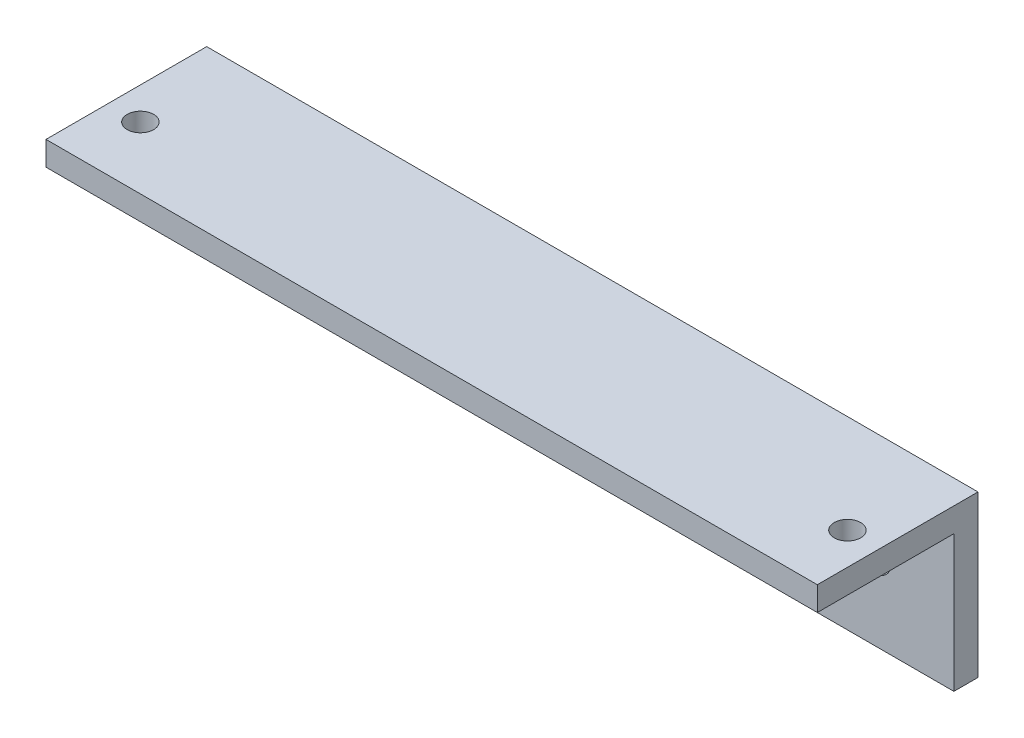
ISO-10303-21;
HEADER;
FILE_DESCRIPTION(('STEP AP214'),'2;1');
FILE_NAME('part.step','',(''),(''),'','','');
FILE_SCHEMA(('AUTOMOTIVE_DESIGN { 1 0 10303 214 1 1 1 1 }'));
ENDSEC;
DATA;
#1=APPLICATION_CONTEXT('core data for automotive mechanical design processes');
#2=APPLICATION_PROTOCOL_DEFINITION('international standard','automotive_design',2000,#1);
#3=PRODUCT_CONTEXT('',#1,'mechanical');
#4=PRODUCT('Part','Part','',(#3));
#5=PRODUCT_RELATED_PRODUCT_CATEGORY('part','',(#4));
#6=PRODUCT_DEFINITION_FORMATION('','',#4);
#7=PRODUCT_DEFINITION_CONTEXT('part definition',#1,'design');
#8=PRODUCT_DEFINITION('design','',#6,#7);
#9=PRODUCT_DEFINITION_SHAPE('','',#8);
#10=(LENGTH_UNIT() NAMED_UNIT(*) SI_UNIT(.MILLI.,.METRE.));
#11=(NAMED_UNIT(*) PLANE_ANGLE_UNIT() SI_UNIT($,.RADIAN.));
#12=(NAMED_UNIT(*) SI_UNIT($,.STERADIAN.) SOLID_ANGLE_UNIT());
#13=UNCERTAINTY_MEASURE_WITH_UNIT(LENGTH_MEASURE(1.E-05),#10,'distance_accuracy_value','');
#14=(GEOMETRIC_REPRESENTATION_CONTEXT(3) GLOBAL_UNCERTAINTY_ASSIGNED_CONTEXT((#13)) GLOBAL_UNIT_ASSIGNED_CONTEXT((#10,
#11,#12)) REPRESENTATION_CONTEXT('',''));
#15=CARTESIAN_POINT('',(0.,0.,0.));
#16=DIRECTION('',(0.,0.,1.));
#17=DIRECTION('',(1.,0.,0.));
#18=AXIS2_PLACEMENT_3D('',#15,#16,#17);
#19=CARTESIAN_POINT('',(48.,10.,3.));
#20=DIRECTION('',(-1.,0.,0.));
#21=DIRECTION('',(0.,0.,1.));
#22=AXIS2_PLACEMENT_3D('',#19,#20,#21);
#23=PLANE('',#22);
#24=DIRECTION('',(0.,1.,0.));
#25=VECTOR('',#24,1.);
#26=CARTESIAN_POINT('',(48.,10.,0.));
#27=LINE('',#26,#25);
#28=CARTESIAN_POINT('',(48.,-10.,0.));
#29=VERTEX_POINT('',#28);
#30=CARTESIAN_POINT('',(48.,10.,0.));
#31=VERTEX_POINT('',#30);
#32=EDGE_CURVE('E105',#29,#31,#27,.T.);
#33=ORIENTED_EDGE('',*,*,#32,.T.);
#34=DIRECTION('',(0.,0.,-1.));
#35=VECTOR('',#34,1.);
#36=CARTESIAN_POINT('',(48.,10.,3.));
#37=LINE('',#36,#35);
#38=CARTESIAN_POINT('',(48.,10.,20.));
#39=VERTEX_POINT('',#38);
#40=EDGE_CURVE('E11',#39,#31,#37,.T.);
#41=ORIENTED_EDGE('',*,*,#40,.F.);
#42=DIRECTION('',(0.,1.,0.));
#43=VECTOR('',#42,1.);
#44=CARTESIAN_POINT('',(48.,10.,20.));
#45=LINE('',#44,#43);
#46=CARTESIAN_POINT('',(48.,7.,20.));
#47=VERTEX_POINT('',#46);
#48=EDGE_CURVE('E149',#47,#39,#45,.T.);
#49=ORIENTED_EDGE('',*,*,#48,.F.);
#50=DIRECTION('',(0.,0.,-1.));
#51=VECTOR('',#50,1.);
#52=CARTESIAN_POINT('',(48.,7.,20.));
#53=LINE('',#52,#51);
#54=CARTESIAN_POINT('',(48.,7.,3.));
#55=VERTEX_POINT('',#54);
#56=EDGE_CURVE('E118',#47,#55,#53,.T.);
#57=ORIENTED_EDGE('',*,*,#56,.T.);
#58=DIRECTION('',(0.,1.,0.));
#59=VECTOR('',#58,1.);
#60=CARTESIAN_POINT('',(48.,10.,3.));
#61=LINE('',#60,#59);
#62=CARTESIAN_POINT('',(48.,-10.,3.));
#63=VERTEX_POINT('',#62);
#64=EDGE_CURVE('E99',#63,#55,#61,.T.);
#65=ORIENTED_EDGE('',*,*,#64,.F.);
#66=DIRECTION('',(0.,0.,-1.));
#67=VECTOR('',#66,1.);
#68=CARTESIAN_POINT('',(48.,-10.,3.));
#69=LINE('',#68,#67);
#70=EDGE_CURVE('E91',#63,#29,#69,.T.);
#71=ORIENTED_EDGE('',*,*,#70,.T.);
#72=EDGE_LOOP('',(#33,#41,#49,#57,#65,#71));
#73=FACE_BOUND('',#72,.T.);
#74=ADVANCED_FACE('F47',(#73),#23,.F.);
#75=CARTESIAN_POINT('',(-48.,10.,3.));
#76=DIRECTION('',(0.,-1.,0.));
#77=DIRECTION('',(0.,0.,-1.));
#78=AXIS2_PLACEMENT_3D('',#75,#76,#77);
#79=PLANE('',#78);
#80=CARTESIAN_POINT('',(-44.,10.,12.25));
#81=DIRECTION('',(0.,1.,0.));
#82=DIRECTION('',(0.,0.,1.));
#83=AXIS2_PLACEMENT_3D('',#80,#81,#82);
#84=CIRCLE('',#83,1.65);
#85=CARTESIAN_POINT('',(-44.,10.,13.9));
#86=VERTEX_POINT('',#85);
#87=EDGE_CURVE('E201',#86,#86,#84,.T.);
#88=ORIENTED_EDGE('',*,*,#87,.F.);
#89=EDGE_LOOP('',(#88));
#90=FACE_BOUND('',#89,.T.);
#91=CARTESIAN_POINT('',(44.,10.,12.25));
#92=DIRECTION('',(0.,1.,0.));
#93=DIRECTION('',(0.,0.,1.));
#94=AXIS2_PLACEMENT_3D('',#91,#92,#93);
#95=CIRCLE('',#94,1.65);
#96=CARTESIAN_POINT('',(44.,10.,13.9));
#97=VERTEX_POINT('',#96);
#98=EDGE_CURVE('E197',#97,#97,#95,.T.);
#99=ORIENTED_EDGE('',*,*,#98,.F.);
#100=EDGE_LOOP('',(#99));
#101=FACE_BOUND('',#100,.T.);
#102=DIRECTION('',(-1.,0.,0.));
#103=VECTOR('',#102,1.);
#104=CARTESIAN_POINT('',(-48.,10.,0.));
#105=LINE('',#104,#103);
#106=CARTESIAN_POINT('',(-48.,10.,0.));
#107=VERTEX_POINT('',#106);
#108=EDGE_CURVE('E110',#31,#107,#105,.T.);
#109=ORIENTED_EDGE('',*,*,#108,.T.);
#110=DIRECTION('',(0.,0.,-1.));
#111=VECTOR('',#110,1.);
#112=CARTESIAN_POINT('',(-48.,10.,3.));
#113=LINE('',#112,#111);
#114=CARTESIAN_POINT('',(-48.,10.,20.));
#115=VERTEX_POINT('',#114);
#116=EDGE_CURVE('E56',#115,#107,#113,.T.);
#117=ORIENTED_EDGE('',*,*,#116,.F.);
#118=DIRECTION('',(-1.,0.,0.));
#119=VECTOR('',#118,1.);
#120=CARTESIAN_POINT('',(-48.,10.,20.));
#121=LINE('',#120,#119);
#122=EDGE_CURVE('E141',#39,#115,#121,.T.);
#123=ORIENTED_EDGE('',*,*,#122,.F.);
#124=ORIENTED_EDGE('',*,*,#40,.T.);
#125=EDGE_LOOP('',(#109,#117,#123,#124));
#126=FACE_BOUND('',#125,.T.);
#127=ADVANCED_FACE('F139',(#90,#101,#126),#79,.F.);
#128=CARTESIAN_POINT('',(-48.,10.,3.));
#129=DIRECTION('',(1.,0.,0.));
#130=DIRECTION('',(0.,0.,-1.));
#131=AXIS2_PLACEMENT_3D('',#128,#129,#130);
#132=PLANE('',#131);
#133=DIRECTION('',(0.,-1.,0.));
#134=VECTOR('',#133,1.);
#135=CARTESIAN_POINT('',(-48.,10.,0.));
#136=LINE('',#135,#134);
#137=CARTESIAN_POINT('',(-48.,-10.,0.));
#138=VERTEX_POINT('',#137);
#139=EDGE_CURVE('E100',#107,#138,#136,.T.);
#140=ORIENTED_EDGE('',*,*,#139,.T.);
#141=DIRECTION('',(0.,0.,-1.));
#142=VECTOR('',#141,1.);
#143=CARTESIAN_POINT('',(-48.,-10.,3.));
#144=LINE('',#143,#142);
#145=CARTESIAN_POINT('',(-48.,-10.,3.));
#146=VERTEX_POINT('',#145);
#147=EDGE_CURVE('E94',#146,#138,#144,.T.);
#148=ORIENTED_EDGE('',*,*,#147,.F.);
#149=DIRECTION('',(0.,-1.,0.));
#150=VECTOR('',#149,1.);
#151=CARTESIAN_POINT('',(-48.,10.,3.));
#152=LINE('',#151,#150);
#153=CARTESIAN_POINT('',(-48.,7.,3.));
#154=VERTEX_POINT('',#153);
#155=EDGE_CURVE('E163',#154,#146,#152,.T.);
#156=ORIENTED_EDGE('',*,*,#155,.F.);
#157=DIRECTION('',(0.,0.,-1.));
#158=VECTOR('',#157,1.);
#159=CARTESIAN_POINT('',(-48.,7.,20.));
#160=LINE('',#159,#158);
#161=CARTESIAN_POINT('',(-48.,7.,20.));
#162=VERTEX_POINT('',#161);
#163=EDGE_CURVE('E112',#162,#154,#160,.T.);
#164=ORIENTED_EDGE('',*,*,#163,.F.);
#165=DIRECTION('',(0.,-1.,0.));
#166=VECTOR('',#165,1.);
#167=CARTESIAN_POINT('',(-48.,10.,20.));
#168=LINE('',#167,#166);
#169=EDGE_CURVE('E135',#115,#162,#168,.T.);
#170=ORIENTED_EDGE('',*,*,#169,.F.);
#171=ORIENTED_EDGE('',*,*,#116,.T.);
#172=EDGE_LOOP('',(#140,#148,#156,#164,#170,#171));
#173=FACE_BOUND('',#172,.T.);
#174=ADVANCED_FACE('F132',(#173),#132,.F.);
#175=CARTESIAN_POINT('',(-48.,-10.,3.));
#176=DIRECTION('',(0.,1.,0.));
#177=DIRECTION('',(0.,0.,1.));
#178=AXIS2_PLACEMENT_3D('',#175,#176,#177);
#179=PLANE('',#178);
#180=DIRECTION('',(1.,0.,0.));
#181=VECTOR('',#180,1.);
#182=CARTESIAN_POINT('',(-48.,-10.,0.));
#183=LINE('',#182,#181);
#184=EDGE_CURVE('E88',#138,#29,#183,.T.);
#185=ORIENTED_EDGE('',*,*,#184,.T.);
#186=ORIENTED_EDGE('',*,*,#70,.F.);
#187=DIRECTION('',(1.,0.,0.));
#188=VECTOR('',#187,1.);
#189=CARTESIAN_POINT('',(-48.,-10.,3.));
#190=LINE('',#189,#188);
#191=EDGE_CURVE('E69',#146,#63,#190,.T.);
#192=ORIENTED_EDGE('',*,*,#191,.F.);
#193=ORIENTED_EDGE('',*,*,#147,.T.);
#194=EDGE_LOOP('',(#185,#186,#192,#193));
#195=FACE_BOUND('',#194,.T.);
#196=ADVANCED_FACE('F90',(#195),#179,.F.);
#197=CARTESIAN_POINT('',(0.,0.,3.));
#198=DIRECTION('',(0.,0.,1.));
#199=DIRECTION('',(1.,0.,0.));
#200=AXIS2_PLACEMENT_3D('',#197,#198,#199);
#201=PLANE('',#200);
#202=CARTESIAN_POINT('',(-38.,0.,3.));
#203=DIRECTION('',(0.,0.,1.));
#204=DIRECTION('',(1.,0.,0.));
#205=AXIS2_PLACEMENT_3D('',#202,#203,#204);
#206=CIRCLE('',#205,2.25);
#207=CARTESIAN_POINT('',(-35.75,0.,3.));
#208=VERTEX_POINT('',#207);
#209=EDGE_CURVE('E189',#208,#208,#206,.T.);
#210=ORIENTED_EDGE('',*,*,#209,.F.);
#211=EDGE_LOOP('',(#210));
#212=FACE_BOUND('',#211,.T.);
#213=CARTESIAN_POINT('',(38.,0.,3.));
#214=DIRECTION('',(0.,0.,1.));
#215=DIRECTION('',(1.,0.,0.));
#216=AXIS2_PLACEMENT_3D('',#213,#214,#215);
#217=CIRCLE('',#216,2.25);
#218=CARTESIAN_POINT('',(40.25,0.,3.));
#219=VERTEX_POINT('',#218);
#220=EDGE_CURVE('E181',#219,#219,#217,.T.);
#221=ORIENTED_EDGE('',*,*,#220,.F.);
#222=EDGE_LOOP('',(#221));
#223=FACE_BOUND('',#222,.T.);
#224=DIRECTION('',(1.,0.,0.));
#225=VECTOR('',#224,1.);
#226=CARTESIAN_POINT('',(-48.,7.,3.));
#227=LINE('',#226,#225);
#228=EDGE_CURVE('E63',#154,#55,#227,.T.);
#229=ORIENTED_EDGE('',*,*,#228,.F.);
#230=ORIENTED_EDGE('',*,*,#155,.T.);
#231=ORIENTED_EDGE('',*,*,#191,.T.);
#232=ORIENTED_EDGE('',*,*,#64,.T.);
#233=EDGE_LOOP('',(#229,#230,#231,#232));
#234=FACE_BOUND('',#233,.T.);
#235=ADVANCED_FACE('F166',(#212,#223,#234),#201,.T.);
#236=CARTESIAN_POINT('',(0.,0.,0.));
#237=DIRECTION('',(0.,0.,1.));
#238=DIRECTION('',(1.,0.,0.));
#239=AXIS2_PLACEMENT_3D('',#236,#237,#238);
#240=PLANE('',#239);
#241=CARTESIAN_POINT('',(-38.,0.,0.));
#242=DIRECTION('',(0.,0.,1.));
#243=DIRECTION('',(1.,0.,0.));
#244=AXIS2_PLACEMENT_3D('',#241,#242,#243);
#245=CIRCLE('',#244,2.25);
#246=CARTESIAN_POINT('',(-35.75,0.,0.));
#247=VERTEX_POINT('',#246);
#248=EDGE_CURVE('E185',#247,#247,#245,.T.);
#249=ORIENTED_EDGE('',*,*,#248,.T.);
#250=EDGE_LOOP('',(#249));
#251=FACE_BOUND('',#250,.T.);
#252=CARTESIAN_POINT('',(38.,0.,0.));
#253=DIRECTION('',(0.,0.,1.));
#254=DIRECTION('',(1.,0.,0.));
#255=AXIS2_PLACEMENT_3D('',#252,#253,#254);
#256=CIRCLE('',#255,2.25);
#257=CARTESIAN_POINT('',(40.25,0.,0.));
#258=VERTEX_POINT('',#257);
#259=EDGE_CURVE('E160',#258,#258,#256,.T.);
#260=ORIENTED_EDGE('',*,*,#259,.T.);
#261=EDGE_LOOP('',(#260));
#262=FACE_BOUND('',#261,.T.);
#263=ORIENTED_EDGE('',*,*,#32,.F.);
#264=ORIENTED_EDGE('',*,*,#184,.F.);
#265=ORIENTED_EDGE('',*,*,#139,.F.);
#266=ORIENTED_EDGE('',*,*,#108,.F.);
#267=EDGE_LOOP('',(#263,#264,#265,#266));
#268=FACE_BOUND('',#267,.T.);
#269=ADVANCED_FACE('F109',(#251,#262,#268),#240,.F.);
#270=CARTESIAN_POINT('',(-48.,7.,20.));
#271=DIRECTION('',(0.,1.,0.));
#272=DIRECTION('',(-1.,0.,0.));
#273=AXIS2_PLACEMENT_3D('',#270,#271,#272);
#274=PLANE('',#273);
#275=CARTESIAN_POINT('',(-44.,7.,12.25));
#276=DIRECTION('',(0.,1.,0.));
#277=DIRECTION('',(-1.,0.,0.));
#278=AXIS2_PLACEMENT_3D('',#275,#276,#277);
#279=CIRCLE('',#278,1.65);
#280=CARTESIAN_POINT('',(-45.65,7.,12.25));
#281=VERTEX_POINT('',#280);
#282=EDGE_CURVE('E50',#281,#281,#279,.T.);
#283=ORIENTED_EDGE('',*,*,#282,.T.);
#284=EDGE_LOOP('',(#283));
#285=FACE_BOUND('',#284,.T.);
#286=CARTESIAN_POINT('',(44.,7.,12.25));
#287=DIRECTION('',(0.,1.,0.));
#288=DIRECTION('',(-1.,0.,0.));
#289=AXIS2_PLACEMENT_3D('',#286,#287,#288);
#290=CIRCLE('',#289,1.65);
#291=CARTESIAN_POINT('',(42.35,7.,12.25));
#292=VERTEX_POINT('',#291);
#293=EDGE_CURVE('E193',#292,#292,#290,.T.);
#294=ORIENTED_EDGE('',*,*,#293,.T.);
#295=EDGE_LOOP('',(#294));
#296=FACE_BOUND('',#295,.T.);
#297=ORIENTED_EDGE('',*,*,#228,.T.);
#298=ORIENTED_EDGE('',*,*,#56,.F.);
#299=DIRECTION('',(1.,0.,0.));
#300=VECTOR('',#299,1.);
#301=CARTESIAN_POINT('',(-48.,7.,20.));
#302=LINE('',#301,#300);
#303=EDGE_CURVE('E155',#162,#47,#302,.T.);
#304=ORIENTED_EDGE('',*,*,#303,.F.);
#305=ORIENTED_EDGE('',*,*,#163,.T.);
#306=EDGE_LOOP('',(#297,#298,#304,#305));
#307=FACE_BOUND('',#306,.T.);
#308=ADVANCED_FACE('F169',(#285,#296,#307),#274,.F.);
#309=CARTESIAN_POINT('',(0.,0.,20.));
#310=DIRECTION('',(0.,0.,1.));
#311=DIRECTION('',(1.,0.,0.));
#312=AXIS2_PLACEMENT_3D('',#309,#310,#311);
#313=PLANE('',#312);
#314=ORIENTED_EDGE('',*,*,#169,.T.);
#315=ORIENTED_EDGE('',*,*,#303,.T.);
#316=ORIENTED_EDGE('',*,*,#48,.T.);
#317=ORIENTED_EDGE('',*,*,#122,.T.);
#318=EDGE_LOOP('',(#314,#315,#316,#317));
#319=FACE_BOUND('',#318,.T.);
#320=ADVANCED_FACE('F145',(#319),#313,.T.);
#321=CARTESIAN_POINT('',(38.,0.,3.));
#322=DIRECTION('',(0.,0.,1.));
#323=DIRECTION('',(1.,0.,0.));
#324=AXIS2_PLACEMENT_3D('',#321,#322,#323);
#325=CYLINDRICAL_SURFACE('',#324,2.25);
#326=ORIENTED_EDGE('',*,*,#259,.F.);
#327=EDGE_LOOP('',(#326));
#328=FACE_BOUND('',#327,.T.);
#329=ORIENTED_EDGE('',*,*,#220,.T.);
#330=EDGE_LOOP('',(#329));
#331=FACE_BOUND('',#330,.T.);
#332=ADVANCED_FACE('F245',(#328,#331),#325,.F.);
#333=CARTESIAN_POINT('',(-38.,0.,3.));
#334=DIRECTION('',(0.,0.,1.));
#335=DIRECTION('',(1.,0.,0.));
#336=AXIS2_PLACEMENT_3D('',#333,#334,#335);
#337=CYLINDRICAL_SURFACE('',#336,2.25);
#338=ORIENTED_EDGE('',*,*,#248,.F.);
#339=EDGE_LOOP('',(#338));
#340=FACE_BOUND('',#339,.T.);
#341=ORIENTED_EDGE('',*,*,#209,.T.);
#342=EDGE_LOOP('',(#341));
#343=FACE_BOUND('',#342,.T.);
#344=ADVANCED_FACE('F219',(#340,#343),#337,.F.);
#345=CARTESIAN_POINT('',(44.,10.,12.25));
#346=DIRECTION('',(0.,1.,0.));
#347=DIRECTION('',(0.,0.,1.));
#348=AXIS2_PLACEMENT_3D('',#345,#346,#347);
#349=CYLINDRICAL_SURFACE('',#348,1.65);
#350=ORIENTED_EDGE('',*,*,#98,.T.);
#351=EDGE_LOOP('',(#350));
#352=FACE_BOUND('',#351,.T.);
#353=ORIENTED_EDGE('',*,*,#293,.F.);
#354=EDGE_LOOP('',(#353));
#355=FACE_BOUND('',#354,.T.);
#356=ADVANCED_FACE('F214',(#352,#355),#349,.F.);
#357=CARTESIAN_POINT('',(-44.,10.,12.25));
#358=DIRECTION('',(0.,1.,0.));
#359=DIRECTION('',(0.,0.,1.));
#360=AXIS2_PLACEMENT_3D('',#357,#358,#359);
#361=CYLINDRICAL_SURFACE('',#360,1.65);
#362=ORIENTED_EDGE('',*,*,#87,.T.);
#363=EDGE_LOOP('',(#362));
#364=FACE_BOUND('',#363,.T.);
#365=ORIENTED_EDGE('',*,*,#282,.F.);
#366=EDGE_LOOP('',(#365));
#367=FACE_BOUND('',#366,.T.);
#368=ADVANCED_FACE('F212',(#364,#367),#361,.F.);
#369=CLOSED_SHELL('',(#74,#127,#174,#196,#235,#269,#308,#320,#332,#344,#356,#368));
#370=MANIFOLD_SOLID_BREP('B2',#369);
#371=ADVANCED_BREP_SHAPE_REPRESENTATION('',(#18,#370),#14);
#372=SHAPE_DEFINITION_REPRESENTATION(#9,#371);
ENDSEC;
END-ISO-10303-21;
